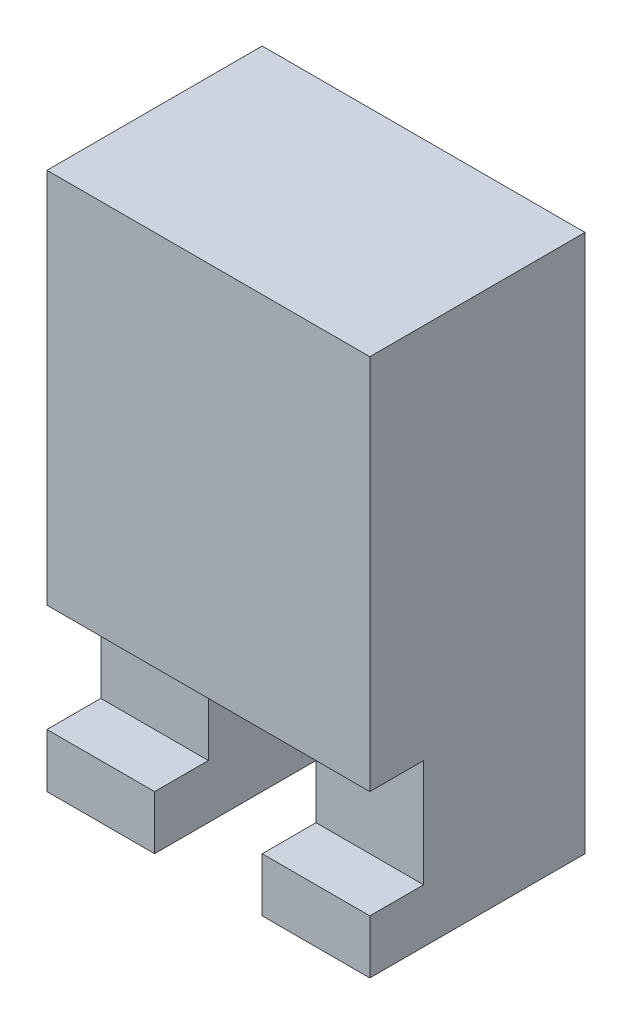
ISO-10303-21;
HEADER;
FILE_DESCRIPTION(('STEP AP214'),'2;1');
FILE_NAME('part.step','',(''),(''),'','','');
FILE_SCHEMA(('AUTOMOTIVE_DESIGN { 1 0 10303 214 1 1 1 1 }'));
ENDSEC;
DATA;
#1=APPLICATION_CONTEXT('core data for automotive mechanical design processes');
#2=APPLICATION_PROTOCOL_DEFINITION('international standard','automotive_design',2000,#1);
#3=PRODUCT_CONTEXT('',#1,'mechanical');
#4=PRODUCT('Part','Part','',(#3));
#5=PRODUCT_RELATED_PRODUCT_CATEGORY('part','',(#4));
#6=PRODUCT_DEFINITION_FORMATION('','',#4);
#7=PRODUCT_DEFINITION_CONTEXT('part definition',#1,'design');
#8=PRODUCT_DEFINITION('design','',#6,#7);
#9=PRODUCT_DEFINITION_SHAPE('','',#8);
#10=(LENGTH_UNIT() NAMED_UNIT(*) SI_UNIT(.MILLI.,.METRE.));
#11=(NAMED_UNIT(*) PLANE_ANGLE_UNIT() SI_UNIT($,.RADIAN.));
#12=(NAMED_UNIT(*) SI_UNIT($,.STERADIAN.) SOLID_ANGLE_UNIT());
#13=UNCERTAINTY_MEASURE_WITH_UNIT(LENGTH_MEASURE(1.E-05),#10,'distance_accuracy_value','');
#14=(GEOMETRIC_REPRESENTATION_CONTEXT(3) GLOBAL_UNCERTAINTY_ASSIGNED_CONTEXT((#13)) GLOBAL_UNIT_ASSIGNED_CONTEXT((#10,
#11,#12)) REPRESENTATION_CONTEXT('',''));
#15=CARTESIAN_POINT('',(0.,0.,0.));
#16=DIRECTION('',(0.,0.,1.));
#17=DIRECTION('',(1.,0.,0.));
#18=AXIS2_PLACEMENT_3D('',#15,#16,#17);
#19=CARTESIAN_POINT('',(-1.5,5.,1.));
#20=DIRECTION('',(0.,0.,-1.));
#21=DIRECTION('',(-1.,0.,0.));
#22=AXIS2_PLACEMENT_3D('',#19,#20,#21);
#23=PLANE('',#22);
#24=DIRECTION('',(1.,0.,0.));
#25=VECTOR('',#24,1.);
#26=CARTESIAN_POINT('',(-1.5,0.5,1.));
#27=LINE('',#26,#25);
#28=CARTESIAN_POINT('',(0.5,0.5,1.));
#29=VERTEX_POINT('',#28);
#30=CARTESIAN_POINT('',(1.5,0.5,1.));
#31=VERTEX_POINT('',#30);
#32=EDGE_CURVE('E231',#29,#31,#27,.T.);
#33=ORIENTED_EDGE('',*,*,#32,.F.);
#34=DIRECTION('',(0.,-1.,0.));
#35=VECTOR('',#34,1.);
#36=CARTESIAN_POINT('',(0.500000000000001,5.,1.));
#37=LINE('',#36,#35);
#38=CARTESIAN_POINT('',(0.5,0.,1.));
#39=VERTEX_POINT('',#38);
#40=EDGE_CURVE('E269',#29,#39,#37,.T.);
#41=ORIENTED_EDGE('',*,*,#40,.T.);
#42=DIRECTION('',(1.,0.,0.));
#43=VECTOR('',#42,1.);
#44=CARTESIAN_POINT('',(-1.5,0.,1.));
#45=LINE('',#44,#43);
#46=CARTESIAN_POINT('',(1.5,0.,1.));
#47=VERTEX_POINT('',#46);
#48=EDGE_CURVE('E167',#39,#47,#45,.T.);
#49=ORIENTED_EDGE('',*,*,#48,.T.);
#50=DIRECTION('',(0.,-1.,0.));
#51=VECTOR('',#50,1.);
#52=CARTESIAN_POINT('',(1.5,5.,1.));
#53=LINE('',#52,#51);
#54=EDGE_CURVE('E201',#31,#47,#53,.T.);
#55=ORIENTED_EDGE('',*,*,#54,.F.);
#56=EDGE_LOOP('',(#33,#41,#49,#55));
#57=FACE_BOUND('',#56,.T.);
#58=ADVANCED_FACE('F45',(#57),#23,.F.);
#59=CARTESIAN_POINT('',(0.,0.,0.));
#60=DIRECTION('',(0.,1.,0.));
#61=DIRECTION('',(0.,0.,1.));
#62=AXIS2_PLACEMENT_3D('',#59,#60,#61);
#63=PLANE('',#62);
#64=ORIENTED_EDGE('',*,*,#48,.F.);
#65=DIRECTION('',(0.,0.,-1.));
#66=VECTOR('',#65,1.);
#67=CARTESIAN_POINT('',(0.5,0.,4.));
#68=LINE('',#67,#66);
#69=CARTESIAN_POINT('',(0.5,0.,-1.));
#70=VERTEX_POINT('',#69);
#71=EDGE_CURVE('E150',#39,#70,#68,.T.);
#72=ORIENTED_EDGE('',*,*,#71,.T.);
#73=DIRECTION('',(-1.,0.,0.));
#74=VECTOR('',#73,1.);
#75=CARTESIAN_POINT('',(-1.5,0.,-1.));
#76=LINE('',#75,#74);
#77=CARTESIAN_POINT('',(1.5,0.,-1.));
#78=VERTEX_POINT('',#77);
#79=EDGE_CURVE('E166',#78,#70,#76,.T.);
#80=ORIENTED_EDGE('',*,*,#79,.F.);
#81=DIRECTION('',(0.,0.,-1.));
#82=VECTOR('',#81,1.);
#83=CARTESIAN_POINT('',(1.5,0.,1.));
#84=LINE('',#83,#82);
#85=EDGE_CURVE('E186',#47,#78,#84,.T.);
#86=ORIENTED_EDGE('',*,*,#85,.F.);
#87=EDGE_LOOP('',(#64,#72,#80,#86));
#88=FACE_BOUND('',#87,.T.);
#89=ADVANCED_FACE('F164',(#88),#63,.F.);
#90=CARTESIAN_POINT('',(-1.5,0.5,0.5));
#91=DIRECTION('',(0.,-1.,0.));
#92=DIRECTION('',(0.,0.,-1.));
#93=AXIS2_PLACEMENT_3D('',#90,#91,#92);
#94=PLANE('',#93);
#95=DIRECTION('',(1.,0.,0.));
#96=VECTOR('',#95,1.);
#97=CARTESIAN_POINT('',(-1.5,0.5,0.5));
#98=LINE('',#97,#96);
#99=CARTESIAN_POINT('',(0.5,0.5,0.5));
#100=VERTEX_POINT('',#99);
#101=CARTESIAN_POINT('',(1.5,0.5,0.5));
#102=VERTEX_POINT('',#101);
#103=EDGE_CURVE('E308',#100,#102,#98,.T.);
#104=ORIENTED_EDGE('',*,*,#103,.F.);
#105=DIRECTION('',(0.,0.,1.));
#106=VECTOR('',#105,1.);
#107=CARTESIAN_POINT('',(0.5,0.5,0.5));
#108=LINE('',#107,#106);
#109=EDGE_CURVE('E301',#100,#29,#108,.T.);
#110=ORIENTED_EDGE('',*,*,#109,.T.);
#111=ORIENTED_EDGE('',*,*,#32,.T.);
#112=DIRECTION('',(0.,0.,1.));
#113=VECTOR('',#112,1.);
#114=CARTESIAN_POINT('',(1.5,0.5,0.5));
#115=LINE('',#114,#113);
#116=EDGE_CURVE('E240',#102,#31,#115,.T.);
#117=ORIENTED_EDGE('',*,*,#116,.F.);
#118=EDGE_LOOP('',(#104,#110,#111,#117));
#119=FACE_BOUND('',#118,.T.);
#120=ADVANCED_FACE('F316',(#119),#94,.F.);
#121=CARTESIAN_POINT('',(0.,0.,0.5));
#122=DIRECTION('',(0.,0.,-1.));
#123=DIRECTION('',(-1.,0.,0.));
#124=AXIS2_PLACEMENT_3D('',#121,#122,#123);
#125=PLANE('',#124);
#126=DIRECTION('',(-1.,0.,0.));
#127=VECTOR('',#126,1.);
#128=CARTESIAN_POINT('',(-1.5,1.5,0.5));
#129=LINE('',#128,#127);
#130=CARTESIAN_POINT('',(1.5,1.5,0.5));
#131=VERTEX_POINT('',#130);
#132=CARTESIAN_POINT('',(0.5,1.5,0.5));
#133=VERTEX_POINT('',#132);
#134=EDGE_CURVE('E216',#131,#133,#129,.T.);
#135=ORIENTED_EDGE('',*,*,#134,.T.);
#136=DIRECTION('',(0.,-1.,0.));
#137=VECTOR('',#136,1.);
#138=CARTESIAN_POINT('',(0.5,0.,0.5));
#139=LINE('',#138,#137);
#140=EDGE_CURVE('E11',#133,#100,#139,.T.);
#141=ORIENTED_EDGE('',*,*,#140,.T.);
#142=ORIENTED_EDGE('',*,*,#103,.T.);
#143=DIRECTION('',(0.,1.,0.));
#144=VECTOR('',#143,1.);
#145=CARTESIAN_POINT('',(1.5,0.5,0.5));
#146=LINE('',#145,#144);
#147=EDGE_CURVE('E217',#102,#131,#146,.T.);
#148=ORIENTED_EDGE('',*,*,#147,.T.);
#149=EDGE_LOOP('',(#135,#141,#142,#148));
#150=FACE_BOUND('',#149,.T.);
#151=ADVANCED_FACE('F313',(#150),#125,.F.);
#152=DIRECTION('',(0.,-1.,0.));
#153=VECTOR('',#152,1.);
#154=CARTESIAN_POINT('',(-1.5,5.,1.));
#155=LINE('',#154,#153);
#156=CARTESIAN_POINT('',(-1.5,5.,1.));
#157=VERTEX_POINT('',#156);
#158=CARTESIAN_POINT('',(-1.5,1.5,1.));
#159=VERTEX_POINT('',#158);
#160=EDGE_CURVE('E190',#157,#159,#155,.T.);
#161=ORIENTED_EDGE('',*,*,#160,.T.);
#162=DIRECTION('',(-1.,0.,0.));
#163=VECTOR('',#162,1.);
#164=CARTESIAN_POINT('',(-1.5,1.5,1.));
#165=LINE('',#164,#163);
#166=CARTESIAN_POINT('',(1.5,1.5,1.));
#167=VERTEX_POINT('',#166);
#168=EDGE_CURVE('E230',#167,#159,#165,.T.);
#169=ORIENTED_EDGE('',*,*,#168,.F.);
#170=CARTESIAN_POINT('',(1.5,5.,1.));
#171=VERTEX_POINT('',#170);
#172=EDGE_CURVE('E202',#171,#167,#53,.T.);
#173=ORIENTED_EDGE('',*,*,#172,.F.);
#174=DIRECTION('',(1.,0.,0.));
#175=VECTOR('',#174,1.);
#176=CARTESIAN_POINT('',(-1.5,5.,1.));
#177=LINE('',#176,#175);
#178=EDGE_CURVE('E184',#157,#171,#177,.T.);
#179=ORIENTED_EDGE('',*,*,#178,.F.);
#180=EDGE_LOOP('',(#161,#169,#173,#179));
#181=FACE_BOUND('',#180,.T.);
#182=ADVANCED_FACE('F321',(#181),#23,.F.);
#183=CARTESIAN_POINT('',(-1.5,0.,1.));
#184=VERTEX_POINT('',#183);
#185=CARTESIAN_POINT('',(-0.5,0.,1.));
#186=VERTEX_POINT('',#185);
#187=EDGE_CURVE('E257',#184,#186,#45,.T.);
#188=ORIENTED_EDGE('',*,*,#187,.T.);
#189=DIRECTION('',(0.,1.,0.));
#190=VECTOR('',#189,1.);
#191=CARTESIAN_POINT('',(-0.499999999999999,5.,1.));
#192=LINE('',#191,#190);
#193=CARTESIAN_POINT('',(-0.5,0.5,1.));
#194=VERTEX_POINT('',#193);
#195=EDGE_CURVE('E298',#186,#194,#192,.T.);
#196=ORIENTED_EDGE('',*,*,#195,.T.);
#197=CARTESIAN_POINT('',(-1.5,0.5,1.));
#198=VERTEX_POINT('',#197);
#199=EDGE_CURVE('E226',#198,#194,#27,.T.);
#200=ORIENTED_EDGE('',*,*,#199,.F.);
#201=EDGE_CURVE('E195',#198,#184,#155,.T.);
#202=ORIENTED_EDGE('',*,*,#201,.T.);
#203=EDGE_LOOP('',(#188,#196,#200,#202));
#204=FACE_BOUND('',#203,.T.);
#205=ADVANCED_FACE('F47',(#204),#23,.F.);
#206=CARTESIAN_POINT('',(1.5,5.,1.));
#207=DIRECTION('',(-1.,0.,0.));
#208=DIRECTION('',(0.,0.,1.));
#209=AXIS2_PLACEMENT_3D('',#206,#207,#208);
#210=PLANE('',#209);
#211=ORIENTED_EDGE('',*,*,#172,.T.);
#212=DIRECTION('',(0.,0.,1.));
#213=VECTOR('',#212,1.);
#214=CARTESIAN_POINT('',(1.5,1.5,0.5));
#215=LINE('',#214,#213);
#216=EDGE_CURVE('E237',#131,#167,#215,.T.);
#217=ORIENTED_EDGE('',*,*,#216,.F.);
#218=ORIENTED_EDGE('',*,*,#147,.F.);
#219=ORIENTED_EDGE('',*,*,#116,.T.);
#220=ORIENTED_EDGE('',*,*,#54,.T.);
#221=ORIENTED_EDGE('',*,*,#85,.T.);
#222=DIRECTION('',(0.,-1.,0.));
#223=VECTOR('',#222,1.);
#224=CARTESIAN_POINT('',(1.5,5.,-1.));
#225=LINE('',#224,#223);
#226=CARTESIAN_POINT('',(1.5,5.,-1.));
#227=VERTEX_POINT('',#226);
#228=EDGE_CURVE('E176',#227,#78,#225,.T.);
#229=ORIENTED_EDGE('',*,*,#228,.F.);
#230=DIRECTION('',(0.,0.,-1.));
#231=VECTOR('',#230,1.);
#232=CARTESIAN_POINT('',(1.5,5.,1.));
#233=LINE('',#232,#231);
#234=EDGE_CURVE('E249',#171,#227,#233,.T.);
#235=ORIENTED_EDGE('',*,*,#234,.F.);
#236=EDGE_LOOP('',(#211,#217,#218,#219,#220,#221,#229,#235));
#237=FACE_BOUND('',#236,.T.);
#238=ADVANCED_FACE('F271',(#237),#210,.F.);
#239=CARTESIAN_POINT('',(-1.5,5.,-1.));
#240=DIRECTION('',(0.,0.,1.));
#241=DIRECTION('',(1.,0.,0.));
#242=AXIS2_PLACEMENT_3D('',#239,#240,#241);
#243=PLANE('',#242);
#244=ORIENTED_EDGE('',*,*,#79,.T.);
#245=DIRECTION('',(0.,-1.,0.));
#246=VECTOR('',#245,1.);
#247=CARTESIAN_POINT('',(0.5,0.,-1.));
#248=LINE('',#247,#246);
#249=CARTESIAN_POINT('',(0.5,1.5,-1.));
#250=VERTEX_POINT('',#249);
#251=EDGE_CURVE('E147',#250,#70,#248,.T.);
#252=ORIENTED_EDGE('',*,*,#251,.F.);
#253=DIRECTION('',(1.,0.,0.));
#254=VECTOR('',#253,1.);
#255=CARTESIAN_POINT('',(0.5,1.5,-1.));
#256=LINE('',#255,#254);
#257=CARTESIAN_POINT('',(-0.499999999999999,1.5,-1.));
#258=VERTEX_POINT('',#257);
#259=EDGE_CURVE('E170',#258,#250,#256,.T.);
#260=ORIENTED_EDGE('',*,*,#259,.F.);
#261=DIRECTION('',(0.,1.,0.));
#262=VECTOR('',#261,1.);
#263=CARTESIAN_POINT('',(-0.5,0.,-1.));
#264=LINE('',#263,#262);
#265=CARTESIAN_POINT('',(-0.5,0.,-1.));
#266=VERTEX_POINT('',#265);
#267=EDGE_CURVE('E159',#266,#258,#264,.T.);
#268=ORIENTED_EDGE('',*,*,#267,.F.);
#269=CARTESIAN_POINT('',(-1.5,0.,-1.));
#270=VERTEX_POINT('',#269);
#271=EDGE_CURVE('E179',#266,#270,#76,.T.);
#272=ORIENTED_EDGE('',*,*,#271,.T.);
#273=DIRECTION('',(0.,-1.,0.));
#274=VECTOR('',#273,1.);
#275=CARTESIAN_POINT('',(-1.5,5.,-1.));
#276=LINE('',#275,#274);
#277=CARTESIAN_POINT('',(-1.5,5.,-1.));
#278=VERTEX_POINT('',#277);
#279=EDGE_CURVE('E194',#278,#270,#276,.T.);
#280=ORIENTED_EDGE('',*,*,#279,.F.);
#281=DIRECTION('',(-1.,0.,0.));
#282=VECTOR('',#281,1.);
#283=CARTESIAN_POINT('',(-1.5,5.,-1.));
#284=LINE('',#283,#282);
#285=EDGE_CURVE('E252',#227,#278,#284,.T.);
#286=ORIENTED_EDGE('',*,*,#285,.F.);
#287=ORIENTED_EDGE('',*,*,#228,.T.);
#288=EDGE_LOOP('',(#244,#252,#260,#268,#272,#280,#286,#287));
#289=FACE_BOUND('',#288,.T.);
#290=ADVANCED_FACE('F173',(#289),#243,.F.);
#291=CARTESIAN_POINT('',(-1.5,5.,1.));
#292=DIRECTION('',(1.,0.,0.));
#293=DIRECTION('',(0.,0.,-1.));
#294=AXIS2_PLACEMENT_3D('',#291,#292,#293);
#295=PLANE('',#294);
#296=DIRECTION('',(0.,-1.,0.));
#297=VECTOR('',#296,1.);
#298=CARTESIAN_POINT('',(-1.5,0.5,0.5));
#299=LINE('',#298,#297);
#300=CARTESIAN_POINT('',(-1.5,1.5,0.5));
#301=VERTEX_POINT('',#300);
#302=CARTESIAN_POINT('',(-1.5,0.5,0.5));
#303=VERTEX_POINT('',#302);
#304=EDGE_CURVE('E234',#301,#303,#299,.T.);
#305=ORIENTED_EDGE('',*,*,#304,.F.);
#306=DIRECTION('',(0.,0.,1.));
#307=VECTOR('',#306,1.);
#308=CARTESIAN_POINT('',(-1.5,1.5,0.5));
#309=LINE('',#308,#307);
#310=EDGE_CURVE('E213',#301,#159,#309,.T.);
#311=ORIENTED_EDGE('',*,*,#310,.T.);
#312=ORIENTED_EDGE('',*,*,#160,.F.);
#313=DIRECTION('',(0.,0.,1.));
#314=VECTOR('',#313,1.);
#315=CARTESIAN_POINT('',(-1.5,5.,1.));
#316=LINE('',#315,#314);
#317=EDGE_CURVE('E255',#278,#157,#316,.T.);
#318=ORIENTED_EDGE('',*,*,#317,.F.);
#319=ORIENTED_EDGE('',*,*,#279,.T.);
#320=DIRECTION('',(0.,0.,1.));
#321=VECTOR('',#320,1.);
#322=CARTESIAN_POINT('',(-1.5,0.,1.));
#323=LINE('',#322,#321);
#324=EDGE_CURVE('E178',#270,#184,#323,.T.);
#325=ORIENTED_EDGE('',*,*,#324,.T.);
#326=ORIENTED_EDGE('',*,*,#201,.F.);
#327=DIRECTION('',(0.,0.,1.));
#328=VECTOR('',#327,1.);
#329=CARTESIAN_POINT('',(-1.5,0.5,0.5));
#330=LINE('',#329,#328);
#331=EDGE_CURVE('E222',#303,#198,#330,.T.);
#332=ORIENTED_EDGE('',*,*,#331,.F.);
#333=EDGE_LOOP('',(#305,#311,#312,#318,#319,#325,#326,#332));
#334=FACE_BOUND('',#333,.T.);
#335=ADVANCED_FACE('F281',(#334),#295,.F.);
#336=CARTESIAN_POINT('',(0.,5.,0.));
#337=DIRECTION('',(0.,1.,0.));
#338=DIRECTION('',(0.,0.,1.));
#339=AXIS2_PLACEMENT_3D('',#336,#337,#338);
#340=PLANE('',#339);
#341=ORIENTED_EDGE('',*,*,#178,.T.);
#342=ORIENTED_EDGE('',*,*,#234,.T.);
#343=ORIENTED_EDGE('',*,*,#285,.T.);
#344=ORIENTED_EDGE('',*,*,#317,.T.);
#345=EDGE_LOOP('',(#341,#342,#343,#344));
#346=FACE_BOUND('',#345,.T.);
#347=ADVANCED_FACE('F350',(#346),#340,.T.);
#348=ORIENTED_EDGE('',*,*,#271,.F.);
#349=DIRECTION('',(0.,0.,-1.));
#350=VECTOR('',#349,1.);
#351=CARTESIAN_POINT('',(-0.5,0.,4.));
#352=LINE('',#351,#350);
#353=EDGE_CURVE('E169',#186,#266,#352,.T.);
#354=ORIENTED_EDGE('',*,*,#353,.F.);
#355=ORIENTED_EDGE('',*,*,#187,.F.);
#356=ORIENTED_EDGE('',*,*,#324,.F.);
#357=EDGE_LOOP('',(#348,#354,#355,#356));
#358=FACE_BOUND('',#357,.T.);
#359=ADVANCED_FACE('F287',(#358),#63,.F.);
#360=CARTESIAN_POINT('',(-1.5,1.5,0.5));
#361=DIRECTION('',(0.,1.,0.));
#362=DIRECTION('',(-1.,0.,0.));
#363=AXIS2_PLACEMENT_3D('',#360,#361,#362);
#364=PLANE('',#363);
#365=CARTESIAN_POINT('',(-0.5,1.5,0.5));
#366=VERTEX_POINT('',#365);
#367=EDGE_CURVE('E68',#366,#301,#129,.T.);
#368=ORIENTED_EDGE('',*,*,#367,.F.);
#369=DIRECTION('',(0.,0.,-1.));
#370=VECTOR('',#369,1.);
#371=CARTESIAN_POINT('',(-0.499999999999999,1.5,4.));
#372=LINE('',#371,#370);
#373=EDGE_CURVE('E61',#366,#258,#372,.T.);
#374=ORIENTED_EDGE('',*,*,#373,.T.);
#375=ORIENTED_EDGE('',*,*,#259,.T.);
#376=DIRECTION('',(0.,0.,-1.));
#377=VECTOR('',#376,1.);
#378=CARTESIAN_POINT('',(0.5,1.5,4.));
#379=LINE('',#378,#377);
#380=EDGE_CURVE('E153',#133,#250,#379,.T.);
#381=ORIENTED_EDGE('',*,*,#380,.F.);
#382=ORIENTED_EDGE('',*,*,#134,.F.);
#383=ORIENTED_EDGE('',*,*,#216,.T.);
#384=ORIENTED_EDGE('',*,*,#168,.T.);
#385=ORIENTED_EDGE('',*,*,#310,.F.);
#386=EDGE_LOOP('',(#368,#374,#375,#381,#382,#383,#384,#385));
#387=FACE_BOUND('',#386,.T.);
#388=ADVANCED_FACE('F211',(#387),#364,.F.);
#389=ORIENTED_EDGE('',*,*,#199,.T.);
#390=DIRECTION('',(0.,0.,-1.));
#391=VECTOR('',#390,1.);
#392=CARTESIAN_POINT('',(-0.5,0.5,0.5));
#393=LINE('',#392,#391);
#394=CARTESIAN_POINT('',(-0.5,0.5,0.5));
#395=VERTEX_POINT('',#394);
#396=EDGE_CURVE('E295',#194,#395,#393,.T.);
#397=ORIENTED_EDGE('',*,*,#396,.T.);
#398=EDGE_CURVE('E208',#303,#395,#98,.T.);
#399=ORIENTED_EDGE('',*,*,#398,.F.);
#400=ORIENTED_EDGE('',*,*,#331,.T.);
#401=EDGE_LOOP('',(#389,#397,#399,#400));
#402=FACE_BOUND('',#401,.T.);
#403=ADVANCED_FACE('F325',(#402),#94,.F.);
#404=ORIENTED_EDGE('',*,*,#398,.T.);
#405=DIRECTION('',(0.,1.,0.));
#406=VECTOR('',#405,1.);
#407=CARTESIAN_POINT('',(-0.5,0.,0.5));
#408=LINE('',#407,#406);
#409=EDGE_CURVE('E54',#395,#366,#408,.T.);
#410=ORIENTED_EDGE('',*,*,#409,.T.);
#411=ORIENTED_EDGE('',*,*,#367,.T.);
#412=ORIENTED_EDGE('',*,*,#304,.T.);
#413=EDGE_LOOP('',(#404,#410,#411,#412));
#414=FACE_BOUND('',#413,.T.);
#415=ADVANCED_FACE('F207',(#414),#125,.F.);
#416=CARTESIAN_POINT('',(0.5,0.,4.));
#417=DIRECTION('',(1.,0.,0.));
#418=DIRECTION('',(0.,1.,0.));
#419=AXIS2_PLACEMENT_3D('',#416,#417,#418);
#420=PLANE('',#419);
#421=ORIENTED_EDGE('',*,*,#109,.F.);
#422=ORIENTED_EDGE('',*,*,#140,.F.);
#423=ORIENTED_EDGE('',*,*,#380,.T.);
#424=ORIENTED_EDGE('',*,*,#251,.T.);
#425=ORIENTED_EDGE('',*,*,#71,.F.);
#426=ORIENTED_EDGE('',*,*,#40,.F.);
#427=EDGE_LOOP('',(#421,#422,#423,#424,#425,#426));
#428=FACE_BOUND('',#427,.T.);
#429=ADVANCED_FACE('F149',(#428),#420,.F.);
#430=CARTESIAN_POINT('',(-0.5,0.,4.));
#431=DIRECTION('',(-1.,0.,0.));
#432=DIRECTION('',(0.,-1.,0.));
#433=AXIS2_PLACEMENT_3D('',#430,#431,#432);
#434=PLANE('',#433);
#435=ORIENTED_EDGE('',*,*,#353,.T.);
#436=ORIENTED_EDGE('',*,*,#267,.T.);
#437=ORIENTED_EDGE('',*,*,#373,.F.);
#438=ORIENTED_EDGE('',*,*,#409,.F.);
#439=ORIENTED_EDGE('',*,*,#396,.F.);
#440=ORIENTED_EDGE('',*,*,#195,.F.);
#441=EDGE_LOOP('',(#435,#436,#437,#438,#439,#440));
#442=FACE_BOUND('',#441,.T.);
#443=ADVANCED_FACE('F326',(#442),#434,.F.);
#444=CLOSED_SHELL('',(#58,#89,#120,#151,#182,#205,#238,#290,#335,#347,#359,#388,#403,#415,#429,#443));
#445=MANIFOLD_SOLID_BREP('B2',#444);
#446=ADVANCED_BREP_SHAPE_REPRESENTATION('',(#18,#445),#14);
#447=SHAPE_DEFINITION_REPRESENTATION(#9,#446);
ENDSEC;
END-ISO-10303-21;
